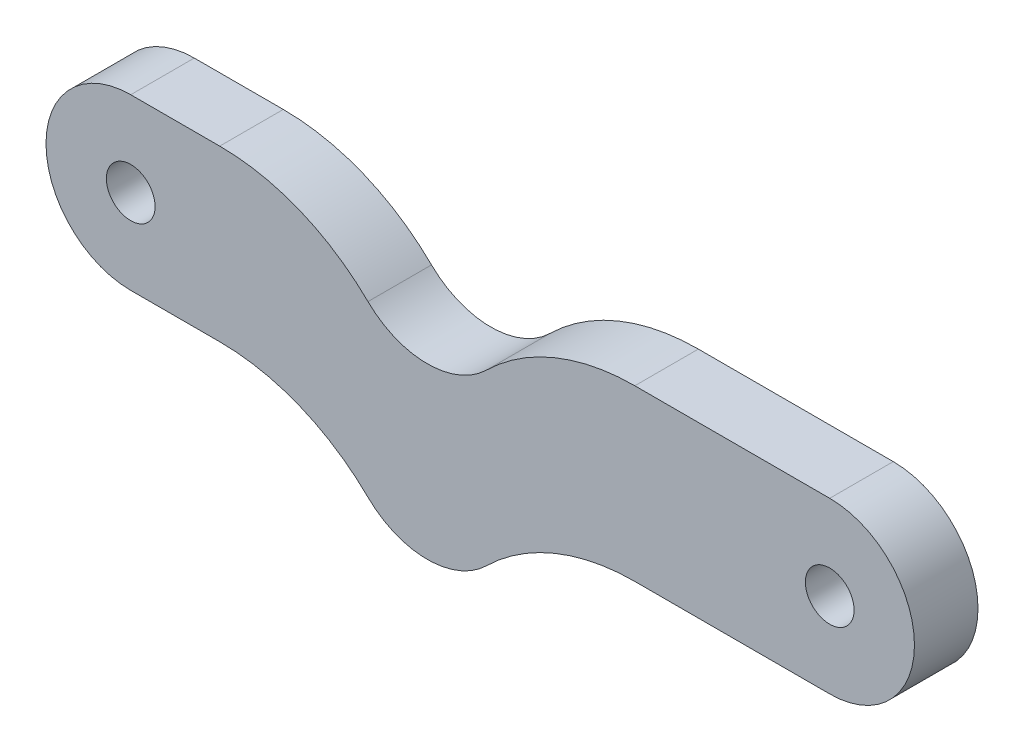
ISO-10303-21;
HEADER;
FILE_DESCRIPTION(('STEP AP214'),'2;1');
FILE_NAME('part.step','',(''),(''),'','','');
FILE_SCHEMA(('AUTOMOTIVE_DESIGN { 1 0 10303 214 1 1 1 1 }'));
ENDSEC;
DATA;
#1=APPLICATION_CONTEXT('core data for automotive mechanical design processes');
#2=APPLICATION_PROTOCOL_DEFINITION('international standard','automotive_design',2000,#1);
#3=PRODUCT_CONTEXT('',#1,'mechanical');
#4=PRODUCT('Part','Part','',(#3));
#5=PRODUCT_RELATED_PRODUCT_CATEGORY('part','',(#4));
#6=PRODUCT_DEFINITION_FORMATION('','',#4);
#7=PRODUCT_DEFINITION_CONTEXT('part definition',#1,'design');
#8=PRODUCT_DEFINITION('design','',#6,#7);
#9=PRODUCT_DEFINITION_SHAPE('','',#8);
#10=(LENGTH_UNIT() NAMED_UNIT(*) SI_UNIT(.MILLI.,.METRE.));
#11=(NAMED_UNIT(*) PLANE_ANGLE_UNIT() SI_UNIT($,.RADIAN.));
#12=(NAMED_UNIT(*) SI_UNIT($,.STERADIAN.) SOLID_ANGLE_UNIT());
#13=UNCERTAINTY_MEASURE_WITH_UNIT(LENGTH_MEASURE(1.E-05),#10,'distance_accuracy_value','');
#14=(GEOMETRIC_REPRESENTATION_CONTEXT(3) GLOBAL_UNCERTAINTY_ASSIGNED_CONTEXT((#13)) GLOBAL_UNIT_ASSIGNED_CONTEXT((#10,
#11,#12)) REPRESENTATION_CONTEXT('',''));
#15=CARTESIAN_POINT('',(0.,0.,0.));
#16=DIRECTION('',(0.,0.,1.));
#17=DIRECTION('',(1.,0.,0.));
#18=AXIS2_PLACEMENT_3D('',#15,#16,#17);
#19=CARTESIAN_POINT('',(4.20204102886728,-6.,3.));
#20=DIRECTION('',(0.,0.,-1.));
#21=DIRECTION('',(-1.,0.,0.));
#22=AXIS2_PLACEMENT_3D('',#19,#20,#21);
#23=CYLINDRICAL_SURFACE('',#22,10.);
#24=CARTESIAN_POINT('',(4.20204102886728,-6.,3.));
#25=DIRECTION('',(0.,0.,1.));
#26=DIRECTION('',(1.,0.,0.));
#27=AXIS2_PLACEMENT_3D('',#24,#25,#26);
#28=CIRCLE('',#27,10.);
#29=CARTESIAN_POINT('',(11.2005831511049,1.14285714285714,3.));
#30=VERTEX_POINT('',#29);
#31=CARTESIAN_POINT('',(4.20204102886729,4.,3.));
#32=VERTEX_POINT('',#31);
#33=EDGE_CURVE('E163',#30,#32,#28,.T.);
#34=ORIENTED_EDGE('',*,*,#33,.F.);
#35=DIRECTION('',(0.,0.,1.));
#36=VECTOR('',#35,1.);
#37=CARTESIAN_POINT('',(11.2005831511049,1.14285714285714,3.));
#38=LINE('',#37,#36);
#39=CARTESIAN_POINT('',(11.2005831511049,1.14285714285714,0.));
#40=VERTEX_POINT('',#39);
#41=EDGE_CURVE('E170',#40,#30,#38,.T.);
#42=ORIENTED_EDGE('',*,*,#41,.F.);
#43=CARTESIAN_POINT('',(4.20204102886728,-6.,0.));
#44=DIRECTION('',(0.,0.,-1.));
#45=DIRECTION('',(1.,0.,0.));
#46=AXIS2_PLACEMENT_3D('',#43,#44,#45);
#47=CIRCLE('',#46,10.);
#48=CARTESIAN_POINT('',(4.20204102886729,4.,0.));
#49=VERTEX_POINT('',#48);
#50=EDGE_CURVE('E11',#49,#40,#47,.T.);
#51=ORIENTED_EDGE('',*,*,#50,.F.);
#52=DIRECTION('',(0.,0.,-1.));
#53=VECTOR('',#52,1.);
#54=CARTESIAN_POINT('',(4.20204102886729,4.,3.));
#55=LINE('',#54,#53);
#56=EDGE_CURVE('E167',#32,#49,#55,.T.);
#57=ORIENTED_EDGE('',*,*,#56,.F.);
#58=EDGE_LOOP('',(#34,#42,#51,#57));
#59=FACE_BOUND('',#58,.T.);
#60=ADVANCED_FACE('F17',(#59),#23,.T.);
#61=CARTESIAN_POINT('',(4.20204102886729,-14.,3.));
#62=DIRECTION('',(0.,0.,-1.));
#63=DIRECTION('',(-1.,0.,0.));
#64=AXIS2_PLACEMENT_3D('',#61,#62,#63);
#65=CYLINDRICAL_SURFACE('',#64,10.);
#66=CARTESIAN_POINT('',(4.20204102886729,-14.,3.));
#67=DIRECTION('',(0.,0.,-1.));
#68=DIRECTION('',(1.,0.,0.));
#69=AXIS2_PLACEMENT_3D('',#66,#67,#68);
#70=CIRCLE('',#69,10.);
#71=CARTESIAN_POINT('',(4.20204102886729,-4.,3.));
#72=VERTEX_POINT('',#71);
#73=CARTESIAN_POINT('',(11.2005831511049,-6.85714285714286,3.));
#74=VERTEX_POINT('',#73);
#75=EDGE_CURVE('E186',#72,#74,#70,.T.);
#76=ORIENTED_EDGE('',*,*,#75,.F.);
#77=DIRECTION('',(0.,0.,1.));
#78=VECTOR('',#77,1.);
#79=CARTESIAN_POINT('',(4.20204102886729,-4.,3.));
#80=LINE('',#79,#78);
#81=CARTESIAN_POINT('',(4.20204102886729,-4.,0.));
#82=VERTEX_POINT('',#81);
#83=EDGE_CURVE('E213',#82,#72,#80,.T.);
#84=ORIENTED_EDGE('',*,*,#83,.F.);
#85=CARTESIAN_POINT('',(4.20204102886729,-14.,0.));
#86=DIRECTION('',(0.,0.,1.));
#87=DIRECTION('',(1.,0.,0.));
#88=AXIS2_PLACEMENT_3D('',#85,#86,#87);
#89=CIRCLE('',#88,10.);
#90=CARTESIAN_POINT('',(11.2005831511049,-6.85714285714286,0.));
#91=VERTEX_POINT('',#90);
#92=EDGE_CURVE('E20',#91,#82,#89,.T.);
#93=ORIENTED_EDGE('',*,*,#92,.F.);
#94=DIRECTION('',(0.,0.,-1.));
#95=VECTOR('',#94,1.);
#96=CARTESIAN_POINT('',(11.2005831511049,-6.85714285714286,3.));
#97=LINE('',#96,#95);
#98=EDGE_CURVE('E243',#74,#91,#97,.T.);
#99=ORIENTED_EDGE('',*,*,#98,.F.);
#100=EDGE_LOOP('',(#76,#84,#93,#99));
#101=FACE_BOUND('',#100,.T.);
#102=ADVANCED_FACE('F212',(#101),#65,.F.);
#103=CARTESIAN_POINT('',(23.7979589711327,-14.,3.));
#104=DIRECTION('',(0.,0.,-1.));
#105=DIRECTION('',(-1.,0.,0.));
#106=AXIS2_PLACEMENT_3D('',#103,#104,#105);
#107=CYLINDRICAL_SURFACE('',#106,10.);
#108=CARTESIAN_POINT('',(23.7979589711327,-14.,3.));
#109=DIRECTION('',(0.,0.,-1.));
#110=DIRECTION('',(1.,0.,0.));
#111=AXIS2_PLACEMENT_3D('',#108,#109,#110);
#112=CIRCLE('',#111,10.);
#113=CARTESIAN_POINT('',(16.7994168488951,-6.85714285714286,3.));
#114=VERTEX_POINT('',#113);
#115=CARTESIAN_POINT('',(23.7979589711327,-4.,3.));
#116=VERTEX_POINT('',#115);
#117=EDGE_CURVE('E181',#114,#116,#112,.T.);
#118=ORIENTED_EDGE('',*,*,#117,.F.);
#119=DIRECTION('',(0.,0.,1.));
#120=VECTOR('',#119,1.);
#121=CARTESIAN_POINT('',(16.7994168488951,-6.85714285714286,3.));
#122=LINE('',#121,#120);
#123=CARTESIAN_POINT('',(16.7994168488951,-6.85714285714286,0.));
#124=VERTEX_POINT('',#123);
#125=EDGE_CURVE('E236',#124,#114,#122,.T.);
#126=ORIENTED_EDGE('',*,*,#125,.F.);
#127=CARTESIAN_POINT('',(23.7979589711327,-14.,0.));
#128=DIRECTION('',(0.,0.,1.));
#129=DIRECTION('',(1.,0.,0.));
#130=AXIS2_PLACEMENT_3D('',#127,#128,#129);
#131=CIRCLE('',#130,10.);
#132=CARTESIAN_POINT('',(23.7979589711327,-4.,0.));
#133=VERTEX_POINT('',#132);
#134=EDGE_CURVE('E195',#133,#124,#131,.T.);
#135=ORIENTED_EDGE('',*,*,#134,.F.);
#136=DIRECTION('',(0.,0.,-1.));
#137=VECTOR('',#136,1.);
#138=CARTESIAN_POINT('',(23.7979589711327,-4.,0.));
#139=LINE('',#138,#137);
#140=EDGE_CURVE('E260',#116,#133,#139,.T.);
#141=ORIENTED_EDGE('',*,*,#140,.F.);
#142=EDGE_LOOP('',(#118,#126,#135,#141));
#143=FACE_BOUND('',#142,.T.);
#144=ADVANCED_FACE('F315',(#143),#107,.F.);
#145=CARTESIAN_POINT('',(23.7979589711327,-6.,3.));
#146=DIRECTION('',(0.,0.,-1.));
#147=DIRECTION('',(-1.,0.,0.));
#148=AXIS2_PLACEMENT_3D('',#145,#146,#147);
#149=CYLINDRICAL_SURFACE('',#148,10.);
#150=CARTESIAN_POINT('',(23.7979589711327,-6.,3.));
#151=DIRECTION('',(0.,0.,1.));
#152=DIRECTION('',(1.,0.,0.));
#153=AXIS2_PLACEMENT_3D('',#150,#151,#152);
#154=CIRCLE('',#153,10.);
#155=CARTESIAN_POINT('',(23.7979589711327,4.,3.));
#156=VERTEX_POINT('',#155);
#157=CARTESIAN_POINT('',(16.7994168488951,1.14285714285714,3.));
#158=VERTEX_POINT('',#157);
#159=EDGE_CURVE('E157',#156,#158,#154,.T.);
#160=ORIENTED_EDGE('',*,*,#159,.F.);
#161=DIRECTION('',(0.,0.,1.));
#162=VECTOR('',#161,1.);
#163=CARTESIAN_POINT('',(23.7979589711327,4.,3.));
#164=LINE('',#163,#162);
#165=CARTESIAN_POINT('',(23.7979589711327,4.,0.));
#166=VERTEX_POINT('',#165);
#167=EDGE_CURVE('E279',#166,#156,#164,.T.);
#168=ORIENTED_EDGE('',*,*,#167,.F.);
#169=CARTESIAN_POINT('',(23.7979589711327,-6.,0.));
#170=DIRECTION('',(0.,0.,-1.));
#171=DIRECTION('',(1.,0.,0.));
#172=AXIS2_PLACEMENT_3D('',#169,#170,#171);
#173=CIRCLE('',#172,10.);
#174=CARTESIAN_POINT('',(16.7994168488951,1.14285714285714,0.));
#175=VERTEX_POINT('',#174);
#176=EDGE_CURVE('E184',#175,#166,#173,.T.);
#177=ORIENTED_EDGE('',*,*,#176,.F.);
#178=DIRECTION('',(0.,0.,-1.));
#179=VECTOR('',#178,1.);
#180=CARTESIAN_POINT('',(16.7994168488951,1.14285714285714,3.));
#181=LINE('',#180,#179);
#182=EDGE_CURVE('E290',#158,#175,#181,.T.);
#183=ORIENTED_EDGE('',*,*,#182,.F.);
#184=EDGE_LOOP('',(#160,#168,#177,#183));
#185=FACE_BOUND('',#184,.T.);
#186=ADVANCED_FACE('F298',(#185),#149,.T.);
#187=CARTESIAN_POINT('',(0.,0.,0.));
#188=DIRECTION('',(0.,0.,1.));
#189=DIRECTION('',(1.,0.,0.));
#190=AXIS2_PLACEMENT_3D('',#187,#188,#189);
#191=PLANE('',#190);
#192=CARTESIAN_POINT('',(33.,0.,0.));
#193=DIRECTION('',(0.,0.,1.));
#194=DIRECTION('',(1.,0.,0.));
#195=AXIS2_PLACEMENT_3D('',#192,#193,#194);
#196=CIRCLE('',#195,1.15);
#197=CARTESIAN_POINT('',(34.15,0.,0.));
#198=VERTEX_POINT('',#197);
#199=EDGE_CURVE('E147',#198,#198,#196,.T.);
#200=ORIENTED_EDGE('',*,*,#199,.T.);
#201=EDGE_LOOP('',(#200));
#202=FACE_BOUND('',#201,.T.);
#203=CARTESIAN_POINT('',(0.,0.,0.));
#204=DIRECTION('',(0.,0.,1.));
#205=DIRECTION('',(1.,0.,0.));
#206=AXIS2_PLACEMENT_3D('',#203,#204,#205);
#207=CIRCLE('',#206,1.15);
#208=CARTESIAN_POINT('',(1.15,0.,0.));
#209=VERTEX_POINT('',#208);
#210=EDGE_CURVE('E222',#209,#209,#207,.T.);
#211=ORIENTED_EDGE('',*,*,#210,.T.);
#212=EDGE_LOOP('',(#211));
#213=FACE_BOUND('',#212,.T.);
#214=CARTESIAN_POINT('',(14.,4.,0.));
#215=DIRECTION('',(0.,0.,1.));
#216=DIRECTION('',(1.,0.,0.));
#217=AXIS2_PLACEMENT_3D('',#214,#215,#216);
#218=CIRCLE('',#217,4.);
#219=EDGE_CURVE('E177',#40,#175,#218,.T.);
#220=ORIENTED_EDGE('',*,*,#219,.T.);
#221=ORIENTED_EDGE('',*,*,#176,.T.);
#222=DIRECTION('',(1.,0.,0.));
#223=VECTOR('',#222,1.);
#224=CARTESIAN_POINT('',(0.,4.,0.));
#225=LINE('',#224,#223);
#226=CARTESIAN_POINT('',(33.,4.,0.));
#227=VERTEX_POINT('',#226);
#228=EDGE_CURVE('E274',#166,#227,#225,.T.);
#229=ORIENTED_EDGE('',*,*,#228,.T.);
#230=CARTESIAN_POINT('',(33.,0.,0.));
#231=DIRECTION('',(0.,0.,1.));
#232=DIRECTION('',(1.,0.,0.));
#233=AXIS2_PLACEMENT_3D('',#230,#231,#232);
#234=CIRCLE('',#233,4.);
#235=CARTESIAN_POINT('',(33.,-4.,0.));
#236=VERTEX_POINT('',#235);
#237=EDGE_CURVE('E252',#236,#227,#234,.T.);
#238=ORIENTED_EDGE('',*,*,#237,.F.);
#239=DIRECTION('',(1.,0.,0.));
#240=VECTOR('',#239,1.);
#241=CARTESIAN_POINT('',(0.,-4.,0.));
#242=LINE('',#241,#240);
#243=EDGE_CURVE('E251',#133,#236,#242,.T.);
#244=ORIENTED_EDGE('',*,*,#243,.F.);
#245=ORIENTED_EDGE('',*,*,#134,.T.);
#246=CARTESIAN_POINT('',(14.,-4.,0.));
#247=DIRECTION('',(0.,0.,1.));
#248=DIRECTION('',(1.,0.,0.));
#249=AXIS2_PLACEMENT_3D('',#246,#247,#248);
#250=CIRCLE('',#249,4.);
#251=EDGE_CURVE('E208',#91,#124,#250,.T.);
#252=ORIENTED_EDGE('',*,*,#251,.F.);
#253=ORIENTED_EDGE('',*,*,#92,.T.);
#254=DIRECTION('',(1.,0.,0.));
#255=VECTOR('',#254,1.);
#256=CARTESIAN_POINT('',(0.,-4.,0.));
#257=LINE('',#256,#255);
#258=CARTESIAN_POINT('',(0.,-4.,0.));
#259=VERTEX_POINT('',#258);
#260=EDGE_CURVE('E206',#259,#82,#257,.T.);
#261=ORIENTED_EDGE('',*,*,#260,.F.);
#262=CARTESIAN_POINT('',(0.,0.,0.));
#263=DIRECTION('',(0.,0.,1.));
#264=DIRECTION('',(1.,0.,0.));
#265=AXIS2_PLACEMENT_3D('',#262,#263,#264);
#266=CIRCLE('',#265,4.);
#267=CARTESIAN_POINT('',(0.,4.,0.));
#268=VERTEX_POINT('',#267);
#269=EDGE_CURVE('E39',#268,#259,#266,.T.);
#270=ORIENTED_EDGE('',*,*,#269,.F.);
#271=DIRECTION('',(1.,0.,0.));
#272=VECTOR('',#271,1.);
#273=CARTESIAN_POINT('',(0.,4.,0.));
#274=LINE('',#273,#272);
#275=EDGE_CURVE('E160',#268,#49,#274,.T.);
#276=ORIENTED_EDGE('',*,*,#275,.T.);
#277=ORIENTED_EDGE('',*,*,#50,.T.);
#278=EDGE_LOOP('',(#220,#221,#229,#238,#244,#245,#252,#253,#261,#270,#276,#277));
#279=FACE_BOUND('',#278,.T.);
#280=ADVANCED_FACE('F204',(#202,#213,#279),#191,.F.);
#281=CARTESIAN_POINT('',(0.,0.,3.));
#282=DIRECTION('',(0.,0.,1.));
#283=DIRECTION('',(1.,0.,0.));
#284=AXIS2_PLACEMENT_3D('',#281,#282,#283);
#285=PLANE('',#284);
#286=CARTESIAN_POINT('',(33.,0.,3.));
#287=DIRECTION('',(0.,0.,1.));
#288=DIRECTION('',(1.,0.,0.));
#289=AXIS2_PLACEMENT_3D('',#286,#287,#288);
#290=CIRCLE('',#289,1.15);
#291=CARTESIAN_POINT('',(34.15,0.,3.));
#292=VERTEX_POINT('',#291);
#293=EDGE_CURVE('E324',#292,#292,#290,.T.);
#294=ORIENTED_EDGE('',*,*,#293,.F.);
#295=EDGE_LOOP('',(#294));
#296=FACE_BOUND('',#295,.T.);
#297=CARTESIAN_POINT('',(0.,0.,3.));
#298=DIRECTION('',(0.,0.,1.));
#299=DIRECTION('',(1.,0.,0.));
#300=AXIS2_PLACEMENT_3D('',#297,#298,#299);
#301=CIRCLE('',#300,1.15);
#302=CARTESIAN_POINT('',(1.15,0.,3.));
#303=VERTEX_POINT('',#302);
#304=EDGE_CURVE('E229',#303,#303,#301,.T.);
#305=ORIENTED_EDGE('',*,*,#304,.F.);
#306=EDGE_LOOP('',(#305));
#307=FACE_BOUND('',#306,.T.);
#308=DIRECTION('',(1.,0.,0.));
#309=VECTOR('',#308,1.);
#310=CARTESIAN_POINT('',(0.,4.,3.));
#311=LINE('',#310,#309);
#312=CARTESIAN_POINT('',(33.,4.,3.));
#313=VERTEX_POINT('',#312);
#314=EDGE_CURVE('E282',#156,#313,#311,.T.);
#315=ORIENTED_EDGE('',*,*,#314,.F.);
#316=ORIENTED_EDGE('',*,*,#159,.T.);
#317=CARTESIAN_POINT('',(14.,4.,3.));
#318=DIRECTION('',(0.,0.,1.));
#319=DIRECTION('',(1.,0.,0.));
#320=AXIS2_PLACEMENT_3D('',#317,#318,#319);
#321=CIRCLE('',#320,4.);
#322=EDGE_CURVE('E284',#30,#158,#321,.T.);
#323=ORIENTED_EDGE('',*,*,#322,.F.);
#324=ORIENTED_EDGE('',*,*,#33,.T.);
#325=DIRECTION('',(1.,0.,0.));
#326=VECTOR('',#325,1.);
#327=CARTESIAN_POINT('',(0.,4.,3.));
#328=LINE('',#327,#326);
#329=CARTESIAN_POINT('',(0.,4.,3.));
#330=VERTEX_POINT('',#329);
#331=EDGE_CURVE('E156',#330,#32,#328,.T.);
#332=ORIENTED_EDGE('',*,*,#331,.F.);
#333=CARTESIAN_POINT('',(0.,0.,3.));
#334=DIRECTION('',(0.,0.,1.));
#335=DIRECTION('',(1.,0.,0.));
#336=AXIS2_PLACEMENT_3D('',#333,#334,#335);
#337=CIRCLE('',#336,4.);
#338=CARTESIAN_POINT('',(0.,-4.,3.));
#339=VERTEX_POINT('',#338);
#340=EDGE_CURVE('E136',#330,#339,#337,.T.);
#341=ORIENTED_EDGE('',*,*,#340,.T.);
#342=DIRECTION('',(1.,0.,0.));
#343=VECTOR('',#342,1.);
#344=CARTESIAN_POINT('',(0.,-4.,3.));
#345=LINE('',#344,#343);
#346=EDGE_CURVE('E220',#339,#72,#345,.T.);
#347=ORIENTED_EDGE('',*,*,#346,.T.);
#348=ORIENTED_EDGE('',*,*,#75,.T.);
#349=CARTESIAN_POINT('',(14.,-4.,3.));
#350=DIRECTION('',(0.,0.,1.));
#351=DIRECTION('',(1.,0.,0.));
#352=AXIS2_PLACEMENT_3D('',#349,#350,#351);
#353=CIRCLE('',#352,4.);
#354=EDGE_CURVE('E239',#74,#114,#353,.T.);
#355=ORIENTED_EDGE('',*,*,#354,.T.);
#356=ORIENTED_EDGE('',*,*,#117,.T.);
#357=DIRECTION('',(1.,0.,0.));
#358=VECTOR('',#357,1.);
#359=CARTESIAN_POINT('',(0.,-4.,3.));
#360=LINE('',#359,#358);
#361=CARTESIAN_POINT('',(33.,-4.,3.));
#362=VERTEX_POINT('',#361);
#363=EDGE_CURVE('E250',#116,#362,#360,.T.);
#364=ORIENTED_EDGE('',*,*,#363,.T.);
#365=CARTESIAN_POINT('',(33.,0.,3.));
#366=DIRECTION('',(0.,0.,1.));
#367=DIRECTION('',(1.,0.,0.));
#368=AXIS2_PLACEMENT_3D('',#365,#366,#367);
#369=CIRCLE('',#368,4.);
#370=EDGE_CURVE('E271',#362,#313,#369,.T.);
#371=ORIENTED_EDGE('',*,*,#370,.T.);
#372=EDGE_LOOP('',(#315,#316,#323,#324,#332,#341,#347,#348,#355,#356,#364,#371));
#373=FACE_BOUND('',#372,.T.);
#374=ADVANCED_FACE('F165',(#296,#307,#373),#285,.T.);
#375=CARTESIAN_POINT('',(0.,4.,3.));
#376=DIRECTION('',(0.,1.,0.));
#377=DIRECTION('',(1.,0.,0.));
#378=AXIS2_PLACEMENT_3D('',#375,#376,#377);
#379=PLANE('',#378);
#380=ORIENTED_EDGE('',*,*,#331,.T.);
#381=ORIENTED_EDGE('',*,*,#56,.T.);
#382=ORIENTED_EDGE('',*,*,#275,.F.);
#383=DIRECTION('',(0.,0.,-1.));
#384=VECTOR('',#383,1.);
#385=CARTESIAN_POINT('',(0.,4.,3.));
#386=LINE('',#385,#384);
#387=EDGE_CURVE('E142',#330,#268,#386,.T.);
#388=ORIENTED_EDGE('',*,*,#387,.F.);
#389=EDGE_LOOP('',(#380,#381,#382,#388));
#390=FACE_BOUND('',#389,.T.);
#391=ADVANCED_FACE('F152',(#390),#379,.T.);
#392=CARTESIAN_POINT('',(14.,4.,3.));
#393=DIRECTION('',(0.,0.,-1.));
#394=DIRECTION('',(-1.,0.,0.));
#395=AXIS2_PLACEMENT_3D('',#392,#393,#394);
#396=CYLINDRICAL_SURFACE('',#395,4.);
#397=ORIENTED_EDGE('',*,*,#322,.T.);
#398=ORIENTED_EDGE('',*,*,#182,.T.);
#399=ORIENTED_EDGE('',*,*,#219,.F.);
#400=ORIENTED_EDGE('',*,*,#41,.T.);
#401=EDGE_LOOP('',(#397,#398,#399,#400));
#402=FACE_BOUND('',#401,.T.);
#403=ADVANCED_FACE('F300',(#402),#396,.F.);
#404=CARTESIAN_POINT('',(0.,4.,3.));
#405=DIRECTION('',(0.,1.,0.));
#406=DIRECTION('',(1.,0.,0.));
#407=AXIS2_PLACEMENT_3D('',#404,#405,#406);
#408=PLANE('',#407);
#409=ORIENTED_EDGE('',*,*,#228,.F.);
#410=ORIENTED_EDGE('',*,*,#167,.T.);
#411=ORIENTED_EDGE('',*,*,#314,.T.);
#412=DIRECTION('',(0.,0.,-1.));
#413=VECTOR('',#412,1.);
#414=CARTESIAN_POINT('',(33.,4.,3.));
#415=LINE('',#414,#413);
#416=EDGE_CURVE('E270',#313,#227,#415,.T.);
#417=ORIENTED_EDGE('',*,*,#416,.T.);
#418=EDGE_LOOP('',(#409,#410,#411,#417));
#419=FACE_BOUND('',#418,.T.);
#420=ADVANCED_FACE('F305',(#419),#408,.T.);
#421=CARTESIAN_POINT('',(33.,0.,3.));
#422=DIRECTION('',(0.,0.,-1.));
#423=DIRECTION('',(-1.,0.,0.));
#424=AXIS2_PLACEMENT_3D('',#421,#422,#423);
#425=CYLINDRICAL_SURFACE('',#424,4.);
#426=ORIENTED_EDGE('',*,*,#237,.T.);
#427=ORIENTED_EDGE('',*,*,#416,.F.);
#428=ORIENTED_EDGE('',*,*,#370,.F.);
#429=DIRECTION('',(0.,0.,-1.));
#430=VECTOR('',#429,1.);
#431=CARTESIAN_POINT('',(33.,-4.,3.));
#432=LINE('',#431,#430);
#433=EDGE_CURVE('E249',#362,#236,#432,.T.);
#434=ORIENTED_EDGE('',*,*,#433,.T.);
#435=EDGE_LOOP('',(#426,#427,#428,#434));
#436=FACE_BOUND('',#435,.T.);
#437=ADVANCED_FACE('F308',(#436),#425,.T.);
#438=CARTESIAN_POINT('',(0.,-4.,3.));
#439=DIRECTION('',(0.,1.,0.));
#440=DIRECTION('',(1.,0.,0.));
#441=AXIS2_PLACEMENT_3D('',#438,#439,#440);
#442=PLANE('',#441);
#443=ORIENTED_EDGE('',*,*,#363,.F.);
#444=ORIENTED_EDGE('',*,*,#140,.T.);
#445=ORIENTED_EDGE('',*,*,#243,.T.);
#446=ORIENTED_EDGE('',*,*,#433,.F.);
#447=EDGE_LOOP('',(#443,#444,#445,#446));
#448=FACE_BOUND('',#447,.T.);
#449=ADVANCED_FACE('F310',(#448),#442,.F.);
#450=CARTESIAN_POINT('',(14.,-4.,3.));
#451=DIRECTION('',(0.,0.,-1.));
#452=DIRECTION('',(-1.,0.,0.));
#453=AXIS2_PLACEMENT_3D('',#450,#451,#452);
#454=CYLINDRICAL_SURFACE('',#453,4.);
#455=ORIENTED_EDGE('',*,*,#251,.T.);
#456=ORIENTED_EDGE('',*,*,#125,.T.);
#457=ORIENTED_EDGE('',*,*,#354,.F.);
#458=ORIENTED_EDGE('',*,*,#98,.T.);
#459=EDGE_LOOP('',(#455,#456,#457,#458));
#460=FACE_BOUND('',#459,.T.);
#461=ADVANCED_FACE('F318',(#460),#454,.T.);
#462=CARTESIAN_POINT('',(0.,-4.,3.));
#463=DIRECTION('',(0.,1.,0.));
#464=DIRECTION('',(1.,0.,0.));
#465=AXIS2_PLACEMENT_3D('',#462,#463,#464);
#466=PLANE('',#465);
#467=ORIENTED_EDGE('',*,*,#260,.T.);
#468=ORIENTED_EDGE('',*,*,#83,.T.);
#469=ORIENTED_EDGE('',*,*,#346,.F.);
#470=DIRECTION('',(0.,0.,-1.));
#471=VECTOR('',#470,1.);
#472=CARTESIAN_POINT('',(0.,-4.,3.));
#473=LINE('',#472,#471);
#474=EDGE_CURVE('E144',#339,#259,#473,.T.);
#475=ORIENTED_EDGE('',*,*,#474,.T.);
#476=EDGE_LOOP('',(#467,#468,#469,#475));
#477=FACE_BOUND('',#476,.T.);
#478=ADVANCED_FACE('F218',(#477),#466,.F.);
#479=CARTESIAN_POINT('',(0.,0.,3.));
#480=DIRECTION('',(0.,0.,-1.));
#481=DIRECTION('',(-1.,0.,0.));
#482=AXIS2_PLACEMENT_3D('',#479,#480,#481);
#483=CYLINDRICAL_SURFACE('',#482,1.15);
#484=ORIENTED_EDGE('',*,*,#210,.F.);
#485=EDGE_LOOP('',(#484));
#486=FACE_BOUND('',#485,.T.);
#487=ORIENTED_EDGE('',*,*,#304,.T.);
#488=EDGE_LOOP('',(#487));
#489=FACE_BOUND('',#488,.T.);
#490=ADVANCED_FACE('F513',(#486,#489),#483,.F.);
#491=CARTESIAN_POINT('',(0.,0.,3.));
#492=DIRECTION('',(0.,0.,-1.));
#493=DIRECTION('',(-1.,0.,0.));
#494=AXIS2_PLACEMENT_3D('',#491,#492,#493);
#495=CYLINDRICAL_SURFACE('',#494,4.);
#496=ORIENTED_EDGE('',*,*,#340,.F.);
#497=ORIENTED_EDGE('',*,*,#387,.T.);
#498=ORIENTED_EDGE('',*,*,#269,.T.);
#499=ORIENTED_EDGE('',*,*,#474,.F.);
#500=EDGE_LOOP('',(#496,#497,#498,#499));
#501=FACE_BOUND('',#500,.T.);
#502=ADVANCED_FACE('F143',(#501),#495,.T.);
#503=CARTESIAN_POINT('',(33.,0.,3.));
#504=DIRECTION('',(0.,0.,-1.));
#505=DIRECTION('',(-1.,0.,0.));
#506=AXIS2_PLACEMENT_3D('',#503,#504,#505);
#507=CYLINDRICAL_SURFACE('',#506,1.15);
#508=ORIENTED_EDGE('',*,*,#199,.F.);
#509=EDGE_LOOP('',(#508));
#510=FACE_BOUND('',#509,.T.);
#511=ORIENTED_EDGE('',*,*,#293,.T.);
#512=EDGE_LOOP('',(#511));
#513=FACE_BOUND('',#512,.T.);
#514=ADVANCED_FACE('F493',(#510,#513),#507,.F.);
#515=CLOSED_SHELL('',(#60,#102,#144,#186,#280,#374,#391,#403,#420,#437,#449,#461,#478,#490,#502,#514));
#516=MANIFOLD_SOLID_BREP('B1',#515);
#517=ADVANCED_BREP_SHAPE_REPRESENTATION('',(#18,#516),#14);
#518=SHAPE_DEFINITION_REPRESENTATION(#9,#517);
ENDSEC;
END-ISO-10303-21;
